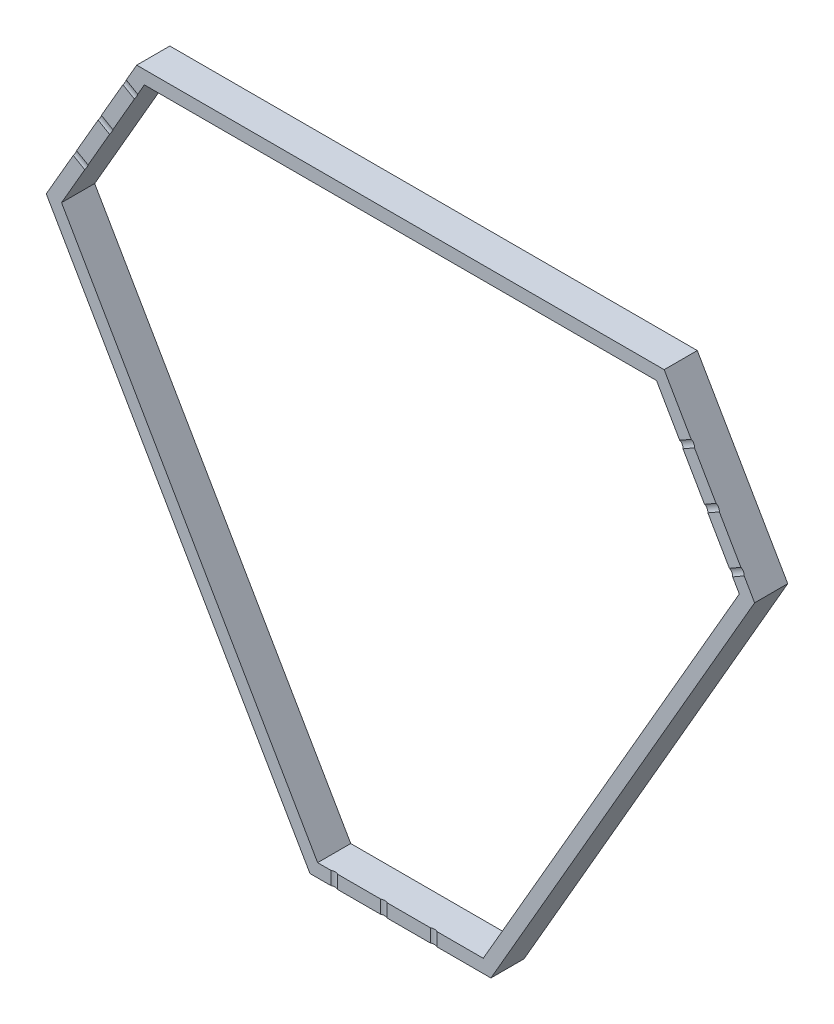
ISO-10303-21;
HEADER;
FILE_DESCRIPTION(('STEP AP214'),'2;1');
FILE_NAME('part.step','',(''),(''),'','','');
FILE_SCHEMA(('AUTOMOTIVE_DESIGN { 1 0 10303 214 1 1 1 1 }'));
ENDSEC;
DATA;
#1=APPLICATION_CONTEXT('core data for automotive mechanical design processes');
#2=APPLICATION_PROTOCOL_DEFINITION('international standard','automotive_design',2000,#1);
#3=PRODUCT_CONTEXT('',#1,'mechanical');
#4=PRODUCT('Part','Part','',(#3));
#5=PRODUCT_RELATED_PRODUCT_CATEGORY('part','',(#4));
#6=PRODUCT_DEFINITION_FORMATION('','',#4);
#7=PRODUCT_DEFINITION_CONTEXT('part definition',#1,'design');
#8=PRODUCT_DEFINITION('design','',#6,#7);
#9=PRODUCT_DEFINITION_SHAPE('','',#8);
#10=(LENGTH_UNIT() NAMED_UNIT(*) SI_UNIT(.MILLI.,.METRE.));
#11=(NAMED_UNIT(*) PLANE_ANGLE_UNIT() SI_UNIT($,.RADIAN.));
#12=(NAMED_UNIT(*) SI_UNIT($,.STERADIAN.) SOLID_ANGLE_UNIT());
#13=UNCERTAINTY_MEASURE_WITH_UNIT(LENGTH_MEASURE(1.E-05),#10,'distance_accuracy_value','');
#14=(GEOMETRIC_REPRESENTATION_CONTEXT(3) GLOBAL_UNCERTAINTY_ASSIGNED_CONTEXT((#13)) GLOBAL_UNIT_ASSIGNED_CONTEXT((#10,
#11,#12)) REPRESENTATION_CONTEXT('',''));
#15=CARTESIAN_POINT('',(0.,0.,0.));
#16=DIRECTION('',(0.,0.,1.));
#17=DIRECTION('',(1.,0.,0.));
#18=AXIS2_PLACEMENT_3D('',#15,#16,#17);
#19=CARTESIAN_POINT('',(0.,0.,-200.));
#20=DIRECTION('',(0.,0.,-1.));
#21=DIRECTION('',(-1.,0.,0.));
#22=AXIS2_PLACEMENT_3D('',#19,#20,#21);
#23=PLANE('',#22);
#24=DIRECTION('',(0.500000000000001,0.866025403784438,0.));
#25=VECTOR('',#24,1.);
#26=CARTESIAN_POINT('',(-221.540106333287,47.0762213579484,-200.));
#27=LINE('',#26,#25);
#28=CARTESIAN_POINT('',(-180.539682271737,118.091038964423,-200.));
#29=VERTEX_POINT('',#28);
#30=CARTESIAN_POINT('',(-167.539682271737,140.607699462818,-200.));
#31=VERTEX_POINT('',#30);
#32=EDGE_CURVE('E639',#29,#31,#27,.T.);
#33=ORIENTED_EDGE('',*,*,#32,.F.);
#34=DIRECTION('',(-0.866025403784438,0.5,0.));
#35=VECTOR('',#34,1.);
#36=CARTESIAN_POINT('',(-173.611479041461,114.091038964423,-200.));
#37=LINE('',#36,#35);
#38=CARTESIAN_POINT('',(-173.611479041461,114.091038964423,-200.));
#39=VERTEX_POINT('',#38);
#40=EDGE_CURVE('E521',#39,#29,#37,.T.);
#41=ORIENTED_EDGE('',*,*,#40,.F.);
#42=DIRECTION('',(0.500000000000001,0.866025403784438,0.));
#43=VECTOR('',#42,1.);
#44=CARTESIAN_POINT('',(-181.611475801544,100.234638115573,-200.));
#45=LINE('',#44,#43);
#46=CARTESIAN_POINT('',(-160.611479041461,136.607699462818,-200.));
#47=VERTEX_POINT('',#46);
#48=EDGE_CURVE('E466',#39,#47,#45,.T.);
#49=ORIENTED_EDGE('',*,*,#48,.T.);
#50=DIRECTION('',(-0.866025403784439,0.5,0.));
#51=VECTOR('',#50,1.);
#52=CARTESIAN_POINT('',(-160.611479041461,136.607699462818,-200.));
#53=LINE('',#52,#51);
#54=EDGE_CURVE('E337',#31,#47,#53,.F.);
#55=ORIENTED_EDGE('',*,*,#54,.F.);
#56=EDGE_LOOP('',(#33,#41,#49,#55));
#57=FACE_BOUND('',#56,.T.);
#58=ADVANCED_FACE('F43',(#57),#23,.F.);
#59=CARTESIAN_POINT('',(-195.539682271737,92.1102768508899,-200.));
#60=VERTEX_POINT('',#59);
#61=CARTESIAN_POINT('',(-182.539682271737,114.626937349285,-200.));
#62=VERTEX_POINT('',#61);
#63=EDGE_CURVE('E543',#60,#62,#27,.T.);
#64=ORIENTED_EDGE('',*,*,#63,.F.);
#65=DIRECTION('',(-0.866025403784438,0.5,0.));
#66=VECTOR('',#65,1.);
#67=CARTESIAN_POINT('',(-188.611479041461,88.1102768508897,-200.));
#68=LINE('',#67,#66);
#69=CARTESIAN_POINT('',(-188.611479041461,88.1102768508897,-200.));
#70=VERTEX_POINT('',#69);
#71=EDGE_CURVE('E534',#70,#60,#68,.T.);
#72=ORIENTED_EDGE('',*,*,#71,.F.);
#73=CARTESIAN_POINT('',(-175.611479041461,110.626937349285,-200.));
#74=VERTEX_POINT('',#73);
#75=EDGE_CURVE('E523',#70,#74,#45,.T.);
#76=ORIENTED_EDGE('',*,*,#75,.T.);
#77=DIRECTION('',(-0.866025403784438,0.5,0.));
#78=VECTOR('',#77,1.);
#79=CARTESIAN_POINT('',(-175.611479041461,110.626937349285,-200.));
#80=LINE('',#79,#78);
#81=EDGE_CURVE('E538',#62,#74,#80,.F.);
#82=ORIENTED_EDGE('',*,*,#81,.F.);
#83=EDGE_LOOP('',(#64,#72,#76,#82));
#84=FACE_BOUND('',#83,.T.);
#85=ADVANCED_FACE('F568',(#84),#23,.F.);
#86=DIRECTION('',(0.499999999999999,-0.866025403784439,0.));
#87=VECTOR('',#86,1.);
#88=CARTESIAN_POINT('',(151.539256776807,168.321249362758,-200.));
#89=LINE('',#88,#87);
#90=CARTESIAN_POINT('',(192.539680838357,97.3064317562841,-200.));
#91=VERTEX_POINT('',#90);
#92=CARTESIAN_POINT('',(205.539680838357,74.7897712578887,-200.));
#93=VERTEX_POINT('',#92);
#94=EDGE_CURVE('E608',#91,#93,#89,.T.);
#95=ORIENTED_EDGE('',*,*,#94,.F.);
#96=DIRECTION('',(0.866025403784439,0.5,0.));
#97=VECTOR('',#96,1.);
#98=CARTESIAN_POINT('',(185.611477608081,93.3064317562838,-200.));
#99=LINE('',#98,#97);
#100=CARTESIAN_POINT('',(185.611477608081,93.3064317562838,-200.));
#101=VERTEX_POINT('',#100);
#102=EDGE_CURVE('E614',#101,#91,#99,.T.);
#103=ORIENTED_EDGE('',*,*,#102,.F.);
#104=DIRECTION('',(0.499999999999999,-0.866025403784439,0.));
#105=VECTOR('',#104,1.);
#106=CARTESIAN_POINT('',(177.611480847998,107.162832605133,-200.));
#107=LINE('',#106,#105);
#108=CARTESIAN_POINT('',(198.611477608081,70.7897712578885,-200.));
#109=VERTEX_POINT('',#108);
#110=EDGE_CURVE('E427',#101,#109,#107,.T.);
#111=ORIENTED_EDGE('',*,*,#110,.T.);
#112=DIRECTION('',(0.866025403784439,0.5,0.));
#113=VECTOR('',#112,1.);
#114=CARTESIAN_POINT('',(198.611477608081,70.7897712578885,-200.));
#115=LINE('',#114,#113);
#116=EDGE_CURVE('E349',#93,#109,#115,.F.);
#117=ORIENTED_EDGE('',*,*,#116,.F.);
#118=EDGE_LOOP('',(#95,#103,#111,#117));
#119=FACE_BOUND('',#118,.T.);
#120=ADVANCED_FACE('F574',(#119),#23,.F.);
#121=DIRECTION('',(-0.866025403784439,0.5,0.));
#122=VECTOR('',#121,1.);
#123=CARTESIAN_POINT('',(-158.611479041461,140.071801077956,-200.));
#124=LINE('',#123,#122);
#125=CARTESIAN_POINT('',(-158.611479041461,140.071801077956,-200.));
#126=VERTEX_POINT('',#125);
#127=CARTESIAN_POINT('',(-165.539682271737,144.071801077956,-200.));
#128=VERTEX_POINT('',#127);
#129=EDGE_CURVE('E516',#126,#128,#124,.T.);
#130=ORIENTED_EDGE('',*,*,#129,.F.);
#131=CARTESIAN_POINT('',(-154.611479041461,147.000004308232,-200.));
#132=VERTEX_POINT('',#131);
#133=EDGE_CURVE('E320',#126,#132,#45,.T.);
#134=ORIENTED_EDGE('',*,*,#133,.T.);
#135=DIRECTION('',(1.,1.37761646906916E-10,0.));
#136=VECTOR('',#135,1.);
#137=CARTESIAN_POINT('',(-246.611440606458,147.000004295558,-200.));
#138=LINE('',#137,#136);
#139=CARTESIAN_POINT('',(154.611477608082,147.000006790919,-200.));
#140=VERTEX_POINT('',#139);
#141=EDGE_CURVE('E321',#132,#140,#138,.T.);
#142=ORIENTED_EDGE('',*,*,#141,.T.);
#143=CARTESIAN_POINT('',(168.611477608081,122.751295484955,-200.));
#144=VERTEX_POINT('',#143);
#145=EDGE_CURVE('E402',#140,#144,#107,.T.);
#146=ORIENTED_EDGE('',*,*,#145,.T.);
#147=DIRECTION('',(0.866025403784439,0.5,0.));
#148=VECTOR('',#147,1.);
#149=CARTESIAN_POINT('',(168.611477608081,122.751295484955,-200.));
#150=LINE('',#149,#148);
#151=CARTESIAN_POINT('',(175.539680838357,126.751295484955,-200.));
#152=VERTEX_POINT('',#151);
#153=EDGE_CURVE('E613',#152,#144,#150,.F.);
#154=ORIENTED_EDGE('',*,*,#153,.F.);
#155=CARTESIAN_POINT('',(159.230283669615,155.000000022035,-200.));
#156=VERTEX_POINT('',#155);
#157=EDGE_CURVE('E476',#156,#152,#89,.T.);
#158=ORIENTED_EDGE('',*,*,#157,.F.);
#159=DIRECTION('',(-1.,-1.38387047711903E-10,0.));
#160=VECTOR('',#159,1.);
#161=CARTESIAN_POINT('',(268.467875151726,155.000000037152,-200.));
#162=LINE('',#161,#160);
#163=CARTESIAN_POINT('',(-159.230283695059,154.999999977965,-200.));
#164=VERTEX_POINT('',#163);
#165=EDGE_CURVE('E424',#156,#164,#162,.T.);
#166=ORIENTED_EDGE('',*,*,#165,.T.);
#167=EDGE_CURVE('E262',#128,#164,#27,.T.);
#168=ORIENTED_EDGE('',*,*,#167,.F.);
#169=EDGE_LOOP('',(#130,#134,#142,#146,#154,#158,#166,#168));
#170=FACE_BOUND('',#169,.T.);
#171=ADVANCED_FACE('F473',(#170),#23,.F.);
#172=CARTESIAN_POINT('',(177.539680838357,123.287193869817,-200.));
#173=VERTEX_POINT('',#172);
#174=CARTESIAN_POINT('',(190.539680838357,100.770533371422,-200.));
#175=VERTEX_POINT('',#174);
#176=EDGE_CURVE('E548',#173,#175,#89,.T.);
#177=ORIENTED_EDGE('',*,*,#176,.F.);
#178=DIRECTION('',(0.866025403784439,0.5,0.));
#179=VECTOR('',#178,1.);
#180=CARTESIAN_POINT('',(170.611477608081,119.287193869817,-200.));
#181=LINE('',#180,#179);
#182=CARTESIAN_POINT('',(170.611477608081,119.287193869817,-200.));
#183=VERTEX_POINT('',#182);
#184=EDGE_CURVE('E353',#183,#173,#181,.T.);
#185=ORIENTED_EDGE('',*,*,#184,.F.);
#186=CARTESIAN_POINT('',(183.611477608081,96.7705333714216,-200.));
#187=VERTEX_POINT('',#186);
#188=EDGE_CURVE('E621',#183,#187,#107,.T.);
#189=ORIENTED_EDGE('',*,*,#188,.T.);
#190=DIRECTION('',(0.866025403784439,0.5,0.));
#191=VECTOR('',#190,1.);
#192=CARTESIAN_POINT('',(183.611477608081,96.7705333714216,-200.));
#193=LINE('',#192,#191);
#194=EDGE_CURVE('E547',#175,#187,#193,.F.);
#195=ORIENTED_EDGE('',*,*,#194,.F.);
#196=EDGE_LOOP('',(#177,#185,#189,#195));
#197=FACE_BOUND('',#196,.T.);
#198=ADVANCED_FACE('F591',(#197),#23,.F.);
#199=CARTESIAN_POINT('',(-213.849079444843,60.3974706911128,-200.));
#200=VERTEX_POINT('',#199);
#201=CARTESIAN_POINT('',(-197.539682271737,88.6461752357522,-200.));
#202=VERTEX_POINT('',#201);
#203=EDGE_CURVE('E331',#200,#202,#27,.T.);
#204=ORIENTED_EDGE('',*,*,#203,.F.);
#205=DIRECTION('',(0.5,-0.866025403784439,0.));
#206=VECTOR('',#205,1.);
#207=CARTESIAN_POINT('',(-121.761531385957,-99.1028412015677,-200.));
#208=LINE('',#207,#206);
#209=CARTESIAN_POINT('',(-54.6187957541475,-215.397470720707,-200.));
#210=VERTEX_POINT('',#209);
#211=EDGE_CURVE('E324',#200,#210,#208,.T.);
#212=ORIENTED_EDGE('',*,*,#211,.T.);
#213=DIRECTION('',(-1.,0.,0.));
#214=VECTOR('',#213,1.);
#215=CARTESIAN_POINT('',(70.0008495564807,-215.397470720707,-200.));
#216=LINE('',#215,#214);
#217=CARTESIAN_POINT('',(-41.9999985666196,-215.397470720707,-200.));
#218=VERTEX_POINT('',#217);
#219=EDGE_CURVE('E264',#218,#210,#216,.T.);
#220=ORIENTED_EDGE('',*,*,#219,.F.);
#221=DIRECTION('',(0.,-1.,0.));
#222=VECTOR('',#221,1.);
#223=CARTESIAN_POINT('',(-41.9999985666196,-207.397470720707,-200.));
#224=LINE('',#223,#222);
#225=CARTESIAN_POINT('',(-41.9999985666196,-207.397470720707,-200.));
#226=VERTEX_POINT('',#225);
#227=EDGE_CURVE('E405',#226,#218,#224,.T.);
#228=ORIENTED_EDGE('',*,*,#227,.F.);
#229=DIRECTION('',(-1.,0.,0.));
#230=VECTOR('',#229,1.);
#231=CARTESIAN_POINT('',(3.99999495354567,-207.397470720707,-200.));
#232=LINE('',#231,#230);
#233=CARTESIAN_POINT('',(-49.9999985666202,-207.397470720706,-200.));
#234=VERTEX_POINT('',#233);
#235=EDGE_CURVE('E397',#226,#234,#232,.T.);
#236=ORIENTED_EDGE('',*,*,#235,.T.);
#237=DIRECTION('',(-0.499999995522719,0.866025406369398,0.));
#238=VECTOR('',#237,1.);
#239=CARTESIAN_POINT('',(-3.99997235182845,-287.07186238818,-200.));
#240=LINE('',#239,#238);
#241=CARTESIAN_POINT('',(-204.611479041461,60.3974639297883,-200.));
#242=VERTEX_POINT('',#241);
#243=EDGE_CURVE('E327',#234,#242,#240,.T.);
#244=ORIENTED_EDGE('',*,*,#243,.T.);
#245=CARTESIAN_POINT('',(-190.611479041461,84.6461752357519,-200.));
#246=VERTEX_POINT('',#245);
#247=EDGE_CURVE('E465',#242,#246,#45,.T.);
#248=ORIENTED_EDGE('',*,*,#247,.T.);
#249=DIRECTION('',(-0.866025403784438,0.5,0.));
#250=VECTOR('',#249,1.);
#251=CARTESIAN_POINT('',(-190.611479041461,84.6461752357519,-200.));
#252=LINE('',#251,#250);
#253=EDGE_CURVE('E528',#202,#246,#252,.F.);
#254=ORIENTED_EDGE('',*,*,#253,.F.);
#255=EDGE_LOOP('',(#204,#212,#220,#228,#236,#244,#248,#254));
#256=FACE_BOUND('',#255,.T.);
#257=ADVANCED_FACE('F407',(#256),#23,.F.);
#258=CARTESIAN_POINT('',(-11.9999985666196,-215.397470720707,-200.));
#259=VERTEX_POINT('',#258);
#260=CARTESIAN_POINT('',(-37.9999985666196,-215.397470720707,-200.));
#261=VERTEX_POINT('',#260);
#262=EDGE_CURVE('E641',#259,#261,#216,.T.);
#263=ORIENTED_EDGE('',*,*,#262,.F.);
#264=DIRECTION('',(0.,-1.,0.));
#265=VECTOR('',#264,1.);
#266=CARTESIAN_POINT('',(-11.9999985666196,-207.397470720707,-200.));
#267=LINE('',#266,#265);
#268=CARTESIAN_POINT('',(-11.9999985666196,-207.397470720707,-200.));
#269=VERTEX_POINT('',#268);
#270=EDGE_CURVE('E314',#269,#259,#267,.T.);
#271=ORIENTED_EDGE('',*,*,#270,.F.);
#272=CARTESIAN_POINT('',(-37.9999985666196,-207.397470720707,-200.));
#273=VERTEX_POINT('',#272);
#274=EDGE_CURVE('E401',#269,#273,#232,.T.);
#275=ORIENTED_EDGE('',*,*,#274,.T.);
#276=DIRECTION('',(0.,-1.,0.));
#277=VECTOR('',#276,1.);
#278=CARTESIAN_POINT('',(-37.9999985666196,-207.397470720707,-200.));
#279=LINE('',#278,#277);
#280=EDGE_CURVE('E354',#261,#273,#279,.F.);
#281=ORIENTED_EDGE('',*,*,#280,.F.);
#282=EDGE_LOOP('',(#263,#271,#275,#281));
#283=FACE_BOUND('',#282,.T.);
#284=ADVANCED_FACE('F420',(#283),#23,.F.);
#285=CARTESIAN_POINT('',(200.611477608081,67.3256696427507,-200.));
#286=VERTEX_POINT('',#285);
#287=CARTESIAN_POINT('',(204.611504666339,60.3974195461969,-200.));
#288=VERTEX_POINT('',#287);
#289=EDGE_CURVE('E426',#286,#288,#107,.T.);
#290=ORIENTED_EDGE('',*,*,#289,.T.);
#291=DIRECTION('',(-0.499999988947861,-0.866025410165394,0.));
#292=VECTOR('',#291,1.);
#293=CARTESIAN_POINT('',(250.611606942048,140.071936189287,-200.));
#294=LINE('',#293,#292);
#295=CARTESIAN_POINT('',(50.0000572399014,-207.397470720707,-200.));
#296=VERTEX_POINT('',#295);
#297=EDGE_CURVE('E255',#288,#296,#294,.T.);
#298=ORIENTED_EDGE('',*,*,#297,.T.);
#299=CARTESIAN_POINT('',(22.0000014333804,-207.397470720707,-200.));
#300=VERTEX_POINT('',#299);
#301=EDGE_CURVE('E384',#296,#300,#232,.T.);
#302=ORIENTED_EDGE('',*,*,#301,.T.);
#303=DIRECTION('',(0.,-1.,0.));
#304=VECTOR('',#303,1.);
#305=CARTESIAN_POINT('',(22.0000014333804,-207.397470720707,-200.));
#306=LINE('',#305,#304);
#307=CARTESIAN_POINT('',(22.0000014333804,-215.397470720707,-200.));
#308=VERTEX_POINT('',#307);
#309=EDGE_CURVE('E68',#308,#300,#306,.F.);
#310=ORIENTED_EDGE('',*,*,#309,.F.);
#311=CARTESIAN_POINT('',(54.6187957366916,-215.397470720707,-200.));
#312=VERTEX_POINT('',#311);
#313=EDGE_CURVE('E256',#312,#308,#216,.T.);
#314=ORIENTED_EDGE('',*,*,#313,.F.);
#315=DIRECTION('',(0.499999999940077,0.866025403819035,0.));
#316=VECTOR('',#315,1.);
#317=CARTESIAN_POINT('',(0.,-310.,-200.));
#318=LINE('',#317,#316);
#319=CARTESIAN_POINT('',(213.84907941067,60.3974707503004,-200.));
#320=VERTEX_POINT('',#319);
#321=EDGE_CURVE('E47',#312,#320,#318,.T.);
#322=ORIENTED_EDGE('',*,*,#321,.T.);
#323=CARTESIAN_POINT('',(207.539680838357,71.3256696427509,-200.));
#324=VERTEX_POINT('',#323);
#325=EDGE_CURVE('E342',#324,#320,#89,.T.);
#326=ORIENTED_EDGE('',*,*,#325,.F.);
#327=DIRECTION('',(0.866025403784439,0.5,0.));
#328=VECTOR('',#327,1.);
#329=CARTESIAN_POINT('',(200.611477608081,67.3256696427507,-200.));
#330=LINE('',#329,#328);
#331=EDGE_CURVE('E429',#286,#324,#330,.T.);
#332=ORIENTED_EDGE('',*,*,#331,.F.);
#333=EDGE_LOOP('',(#290,#298,#302,#310,#314,#322,#326,#332));
#334=FACE_BOUND('',#333,.T.);
#335=ADVANCED_FACE('F258',(#334),#23,.F.);
#336=CARTESIAN_POINT('',(18.0000014333804,-215.397470720707,-200.));
#337=VERTEX_POINT('',#336);
#338=CARTESIAN_POINT('',(-7.99999856661964,-215.397470720707,-200.));
#339=VERTEX_POINT('',#338);
#340=EDGE_CURVE('E261',#337,#339,#216,.T.);
#341=ORIENTED_EDGE('',*,*,#340,.F.);
#342=DIRECTION('',(0.,-1.,0.));
#343=VECTOR('',#342,1.);
#344=CARTESIAN_POINT('',(18.0000014333804,-207.397470720707,-200.));
#345=LINE('',#344,#343);
#346=CARTESIAN_POINT('',(18.0000014333804,-207.397470720707,-200.));
#347=VERTEX_POINT('',#346);
#348=EDGE_CURVE('E313',#347,#337,#345,.T.);
#349=ORIENTED_EDGE('',*,*,#348,.F.);
#350=CARTESIAN_POINT('',(-7.99999856661964,-207.397470720707,-200.));
#351=VERTEX_POINT('',#350);
#352=EDGE_CURVE('E60',#347,#351,#232,.T.);
#353=ORIENTED_EDGE('',*,*,#352,.T.);
#354=DIRECTION('',(0.,-1.,0.));
#355=VECTOR('',#354,1.);
#356=CARTESIAN_POINT('',(-7.99999856661964,-207.397470720707,-200.));
#357=LINE('',#356,#355);
#358=EDGE_CURVE('E411',#339,#351,#357,.F.);
#359=ORIENTED_EDGE('',*,*,#358,.F.);
#360=EDGE_LOOP('',(#341,#349,#353,#359));
#361=FACE_BOUND('',#360,.T.);
#362=ADVANCED_FACE('F555',(#361),#23,.F.);
#363=CARTESIAN_POINT('',(0.,0.,-220.));
#364=DIRECTION('',(0.,0.,-1.));
#365=DIRECTION('',(-1.,0.,0.));
#366=AXIS2_PLACEMENT_3D('',#363,#364,#365);
#367=PLANE('',#366);
#368=DIRECTION('',(0.5,-0.866025403784439,0.));
#369=VECTOR('',#368,1.);
#370=CARTESIAN_POINT('',(-121.761531385957,-99.1028412015677,-220.));
#371=LINE('',#370,#369);
#372=CARTESIAN_POINT('',(-213.849079444843,60.3974706911128,-220.));
#373=VERTEX_POINT('',#372);
#374=CARTESIAN_POINT('',(-54.6187957541475,-215.397470720707,-220.));
#375=VERTEX_POINT('',#374);
#376=EDGE_CURVE('E332',#373,#375,#371,.T.);
#377=ORIENTED_EDGE('',*,*,#376,.F.);
#378=DIRECTION('',(0.500000000000001,0.866025403784438,0.));
#379=VECTOR('',#378,1.);
#380=CARTESIAN_POINT('',(-221.540106333287,47.0762213579484,-220.));
#381=LINE('',#380,#379);
#382=CARTESIAN_POINT('',(-159.230283695059,154.999999977965,-220.));
#383=VERTEX_POINT('',#382);
#384=EDGE_CURVE('E323',#373,#383,#381,.T.);
#385=ORIENTED_EDGE('',*,*,#384,.T.);
#386=DIRECTION('',(-1.,-1.38387047711903E-10,0.));
#387=VECTOR('',#386,1.);
#388=CARTESIAN_POINT('',(268.467875151726,155.000000037152,-220.));
#389=LINE('',#388,#387);
#390=CARTESIAN_POINT('',(159.230283669615,155.000000022035,-220.));
#391=VERTEX_POINT('',#390);
#392=EDGE_CURVE('E341',#391,#383,#389,.T.);
#393=ORIENTED_EDGE('',*,*,#392,.F.);
#394=DIRECTION('',(0.499999999999999,-0.866025403784439,0.));
#395=VECTOR('',#394,1.);
#396=CARTESIAN_POINT('',(151.539256776807,168.321249362758,-220.));
#397=LINE('',#396,#395);
#398=CARTESIAN_POINT('',(213.84907941067,60.3974707503004,-220.));
#399=VERTEX_POINT('',#398);
#400=EDGE_CURVE('E317',#391,#399,#397,.T.);
#401=ORIENTED_EDGE('',*,*,#400,.T.);
#402=DIRECTION('',(0.499999999940077,0.866025403819035,0.));
#403=VECTOR('',#402,1.);
#404=CARTESIAN_POINT('',(0.,-310.,-220.));
#405=LINE('',#404,#403);
#406=CARTESIAN_POINT('',(54.6187957366916,-215.397470720707,-220.));
#407=VERTEX_POINT('',#406);
#408=EDGE_CURVE('E352',#407,#399,#405,.T.);
#409=ORIENTED_EDGE('',*,*,#408,.F.);
#410=DIRECTION('',(-1.,0.,0.));
#411=VECTOR('',#410,1.);
#412=CARTESIAN_POINT('',(70.0008495564807,-215.397470720707,-220.));
#413=LINE('',#412,#411);
#414=EDGE_CURVE('E269',#407,#375,#413,.T.);
#415=ORIENTED_EDGE('',*,*,#414,.T.);
#416=EDGE_LOOP('',(#377,#385,#393,#401,#409,#415));
#417=FACE_BOUND('',#416,.T.);
#418=DIRECTION('',(-0.499999995522719,0.866025406369398,0.));
#419=VECTOR('',#418,1.);
#420=CARTESIAN_POINT('',(-3.99997235182845,-287.07186238818,-220.));
#421=LINE('',#420,#419);
#422=CARTESIAN_POINT('',(-49.9999985666202,-207.397470720706,-220.));
#423=VERTEX_POINT('',#422);
#424=CARTESIAN_POINT('',(-204.611479041461,60.3974639297883,-220.));
#425=VERTEX_POINT('',#424);
#426=EDGE_CURVE('E328',#423,#425,#421,.T.);
#427=ORIENTED_EDGE('',*,*,#426,.F.);
#428=DIRECTION('',(-1.,0.,0.));
#429=VECTOR('',#428,1.);
#430=CARTESIAN_POINT('',(3.99999495354567,-207.397470720707,-220.));
#431=LINE('',#430,#429);
#432=CARTESIAN_POINT('',(50.0000572399014,-207.397470720707,-220.));
#433=VERTEX_POINT('',#432);
#434=EDGE_CURVE('E344',#433,#423,#431,.T.);
#435=ORIENTED_EDGE('',*,*,#434,.F.);
#436=DIRECTION('',(-0.499999988947861,-0.866025410165394,0.));
#437=VECTOR('',#436,1.);
#438=CARTESIAN_POINT('',(250.611606942048,140.071936189287,-220.));
#439=LINE('',#438,#437);
#440=CARTESIAN_POINT('',(204.611504666339,60.3974195461969,-220.));
#441=VERTEX_POINT('',#440);
#442=EDGE_CURVE('E350',#441,#433,#439,.T.);
#443=ORIENTED_EDGE('',*,*,#442,.F.);
#444=DIRECTION('',(0.499999999999999,-0.866025403784439,0.));
#445=VECTOR('',#444,1.);
#446=CARTESIAN_POINT('',(177.611480847998,107.162832605133,-220.));
#447=LINE('',#446,#445);
#448=CARTESIAN_POINT('',(154.611477608082,147.000006790919,-220.));
#449=VERTEX_POINT('',#448);
#450=EDGE_CURVE('E346',#449,#441,#447,.T.);
#451=ORIENTED_EDGE('',*,*,#450,.F.);
#452=DIRECTION('',(1.,1.37761646906916E-10,0.));
#453=VECTOR('',#452,1.);
#454=CARTESIAN_POINT('',(-246.611440606458,147.000004295558,-220.));
#455=LINE('',#454,#453);
#456=CARTESIAN_POINT('',(-154.611479041461,147.000004308232,-220.));
#457=VERTEX_POINT('',#456);
#458=EDGE_CURVE('E338',#457,#449,#455,.T.);
#459=ORIENTED_EDGE('',*,*,#458,.F.);
#460=DIRECTION('',(0.500000000000001,0.866025403784438,0.));
#461=VECTOR('',#460,1.);
#462=CARTESIAN_POINT('',(-181.611475801544,100.234638115573,-220.));
#463=LINE('',#462,#461);
#464=EDGE_CURVE('E334',#425,#457,#463,.T.);
#465=ORIENTED_EDGE('',*,*,#464,.F.);
#466=EDGE_LOOP('',(#427,#435,#443,#451,#459,#465));
#467=FACE_BOUND('',#466,.T.);
#468=ADVANCED_FACE('F390',(#417,#467),#367,.T.);
#469=CARTESIAN_POINT('',(-181.611475801544,100.234638115573,140.));
#470=DIRECTION('',(0.866025403784437,-0.5,0.));
#471=DIRECTION('',(0.,0.,-1.));
#472=AXIS2_PLACEMENT_3D('',#469,#470,#471);
#473=PLANE('',#472);
#474=ORIENTED_EDGE('',*,*,#247,.F.);
#475=DIRECTION('',(0.,0.,-1.));
#476=VECTOR('',#475,1.);
#477=CARTESIAN_POINT('',(-204.611479041461,60.3974639297883,140.));
#478=LINE('',#477,#476);
#479=EDGE_CURVE('E445',#242,#425,#478,.T.);
#480=ORIENTED_EDGE('',*,*,#479,.T.);
#481=ORIENTED_EDGE('',*,*,#464,.T.);
#482=DIRECTION('',(0.,0.,-1.));
#483=VECTOR('',#482,1.);
#484=CARTESIAN_POINT('',(-154.611479041461,147.000004308232,140.));
#485=LINE('',#484,#483);
#486=EDGE_CURVE('E439',#132,#457,#485,.T.);
#487=ORIENTED_EDGE('',*,*,#486,.F.);
#488=ORIENTED_EDGE('',*,*,#133,.F.);
#489=CARTESIAN_POINT('',(-159.611479041461,138.339750270387,-196.25));
#490=DIRECTION('',(-0.866025403784439,0.5,0.));
#491=DIRECTION('',(0.5,0.866025403784439,0.));
#492=AXIS2_PLACEMENT_3D('',#489,#490,#491);
#493=CIRCLE('',#492,4.25);
#494=EDGE_CURVE('E451',#126,#47,#493,.T.);
#495=ORIENTED_EDGE('',*,*,#494,.T.);
#496=ORIENTED_EDGE('',*,*,#48,.F.);
#497=CARTESIAN_POINT('',(-174.611479041461,112.358988156854,-196.25));
#498=DIRECTION('',(-0.866025403784438,0.5,0.));
#499=DIRECTION('',(0.5,0.866025403784438,0.));
#500=AXIS2_PLACEMENT_3D('',#497,#498,#499);
#501=CIRCLE('',#500,4.25);
#502=EDGE_CURVE('E499',#39,#74,#501,.T.);
#503=ORIENTED_EDGE('',*,*,#502,.T.);
#504=ORIENTED_EDGE('',*,*,#75,.F.);
#505=CARTESIAN_POINT('',(-189.611479041461,86.3782260433208,-196.25));
#506=DIRECTION('',(-0.866025403784438,0.5,0.));
#507=DIRECTION('',(0.5,0.866025403784438,0.));
#508=AXIS2_PLACEMENT_3D('',#505,#506,#507);
#509=CIRCLE('',#508,4.25);
#510=EDGE_CURVE('E487',#70,#246,#509,.T.);
#511=ORIENTED_EDGE('',*,*,#510,.T.);
#512=EDGE_LOOP('',(#474,#480,#481,#487,#488,#495,#496,#503,#504,#511));
#513=FACE_BOUND('',#512,.T.);
#514=ADVANCED_FACE('F510',(#513),#473,.T.);
#515=CARTESIAN_POINT('',(-221.540106333287,47.0762213579484,0.));
#516=DIRECTION('',(0.866025403784437,-0.5,0.));
#517=DIRECTION('',(0.,0.,-1.));
#518=AXIS2_PLACEMENT_3D('',#515,#516,#517);
#519=PLANE('',#518);
#520=DIRECTION('',(0.,0.,-1.));
#521=VECTOR('',#520,1.);
#522=CARTESIAN_POINT('',(-213.849079444843,60.3974706911128,0.));
#523=LINE('',#522,#521);
#524=EDGE_CURVE('E316',#200,#373,#523,.T.);
#525=ORIENTED_EDGE('',*,*,#524,.F.);
#526=ORIENTED_EDGE('',*,*,#203,.T.);
#527=CARTESIAN_POINT('',(-196.539682271737,90.3782260433209,-196.25));
#528=DIRECTION('',(0.866025403784438,-0.5,0.));
#529=DIRECTION('',(0.5,0.866025403784438,0.));
#530=AXIS2_PLACEMENT_3D('',#527,#528,#529);
#531=CIRCLE('',#530,4.25);
#532=EDGE_CURVE('E493',#202,#60,#531,.T.);
#533=ORIENTED_EDGE('',*,*,#532,.T.);
#534=ORIENTED_EDGE('',*,*,#63,.T.);
#535=CARTESIAN_POINT('',(-181.539682271737,116.358988156854,-196.25));
#536=DIRECTION('',(0.866025403784438,-0.5,0.));
#537=DIRECTION('',(0.5,0.866025403784438,0.));
#538=AXIS2_PLACEMENT_3D('',#535,#536,#537);
#539=CIRCLE('',#538,4.25);
#540=EDGE_CURVE('E503',#62,#29,#539,.T.);
#541=ORIENTED_EDGE('',*,*,#540,.T.);
#542=ORIENTED_EDGE('',*,*,#32,.T.);
#543=CARTESIAN_POINT('',(-166.539682271737,142.339750270387,-196.25));
#544=DIRECTION('',(0.866025403784439,-0.5,0.));
#545=DIRECTION('',(0.5,0.866025403784439,0.));
#546=AXIS2_PLACEMENT_3D('',#543,#544,#545);
#547=CIRCLE('',#546,4.25);
#548=EDGE_CURVE('E444',#31,#128,#547,.T.);
#549=ORIENTED_EDGE('',*,*,#548,.T.);
#550=ORIENTED_EDGE('',*,*,#167,.T.);
#551=DIRECTION('',(0.,0.,1.));
#552=VECTOR('',#551,1.);
#553=CARTESIAN_POINT('',(-159.230283695059,154.999999977965,0.));
#554=LINE('',#553,#552);
#555=EDGE_CURVE('E481',#383,#164,#554,.T.);
#556=ORIENTED_EDGE('',*,*,#555,.F.);
#557=ORIENTED_EDGE('',*,*,#384,.F.);
#558=EDGE_LOOP('',(#525,#526,#533,#534,#541,#542,#549,#550,#556,#557));
#559=FACE_BOUND('',#558,.T.);
#560=ADVANCED_FACE('F638',(#559),#519,.F.);
#561=CARTESIAN_POINT('',(-3.99997235182845,-287.07186238818,0.));
#562=DIRECTION('',(0.866025406369398,0.499999995522719,0.));
#563=DIRECTION('',(0.,0.,-1.));
#564=AXIS2_PLACEMENT_3D('',#561,#562,#563);
#565=PLANE('',#564);
#566=ORIENTED_EDGE('',*,*,#243,.F.);
#567=DIRECTION('',(0.,0.,-1.));
#568=VECTOR('',#567,1.);
#569=CARTESIAN_POINT('',(-49.9999985666202,-207.397470720706,140.));
#570=LINE('',#569,#568);
#571=EDGE_CURVE('E373',#234,#423,#570,.T.);
#572=ORIENTED_EDGE('',*,*,#571,.T.);
#573=ORIENTED_EDGE('',*,*,#426,.T.);
#574=ORIENTED_EDGE('',*,*,#479,.F.);
#575=EDGE_LOOP('',(#566,#572,#573,#574));
#576=FACE_BOUND('',#575,.T.);
#577=ADVANCED_FACE('F394',(#576),#565,.T.);
#578=CARTESIAN_POINT('',(-246.611440606458,147.000004295558,-100.));
#579=DIRECTION('',(1.37761646906916E-10,-1.,0.));
#580=DIRECTION('',(0.,0.,-1.));
#581=AXIS2_PLACEMENT_3D('',#578,#579,#580);
#582=PLANE('',#581);
#583=ORIENTED_EDGE('',*,*,#141,.F.);
#584=ORIENTED_EDGE('',*,*,#486,.T.);
#585=ORIENTED_EDGE('',*,*,#458,.T.);
#586=DIRECTION('',(0.,0.,-1.));
#587=VECTOR('',#586,1.);
#588=CARTESIAN_POINT('',(154.611477608082,147.000006790919,140.));
#589=LINE('',#588,#587);
#590=EDGE_CURVE('E305',#140,#449,#589,.T.);
#591=ORIENTED_EDGE('',*,*,#590,.F.);
#592=EDGE_LOOP('',(#583,#584,#585,#591));
#593=FACE_BOUND('',#592,.T.);
#594=ADVANCED_FACE('F437',(#593),#582,.T.);
#595=CARTESIAN_POINT('',(151.539256776807,168.321249362758,0.));
#596=DIRECTION('',(-0.86602540378444,-0.5,0.));
#597=DIRECTION('',(-0.5,0.86602540378444,0.));
#598=AXIS2_PLACEMENT_3D('',#595,#596,#597);
#599=PLANE('',#598);
#600=DIRECTION('',(0.,0.,-1.));
#601=VECTOR('',#600,1.);
#602=CARTESIAN_POINT('',(159.230283669615,155.000000022035,0.));
#603=LINE('',#602,#601);
#604=EDGE_CURVE('E486',#156,#391,#603,.T.);
#605=ORIENTED_EDGE('',*,*,#604,.F.);
#606=ORIENTED_EDGE('',*,*,#157,.T.);
#607=CARTESIAN_POINT('',(176.539680838357,125.019244677386,-196.25));
#608=DIRECTION('',(-0.866025403784439,-0.5,0.));
#609=DIRECTION('',(0.5,-0.866025403784439,0.));
#610=AXIS2_PLACEMENT_3D('',#607,#608,#609);
#611=CIRCLE('',#610,4.25);
#612=EDGE_CURVE('E279',#152,#173,#611,.T.);
#613=ORIENTED_EDGE('',*,*,#612,.T.);
#614=ORIENTED_EDGE('',*,*,#176,.T.);
#615=CARTESIAN_POINT('',(191.539680838357,99.0384825638528,-196.25));
#616=DIRECTION('',(-0.866025403784439,-0.5,0.));
#617=DIRECTION('',(0.5,-0.866025403784439,0.));
#618=AXIS2_PLACEMENT_3D('',#615,#616,#617);
#619=CIRCLE('',#618,4.25);
#620=EDGE_CURVE('E290',#175,#91,#619,.T.);
#621=ORIENTED_EDGE('',*,*,#620,.T.);
#622=ORIENTED_EDGE('',*,*,#94,.T.);
#623=CARTESIAN_POINT('',(206.539680838357,73.0577204503196,-196.25));
#624=DIRECTION('',(-0.866025403784439,-0.5,0.));
#625=DIRECTION('',(0.5,-0.866025403784439,0.));
#626=AXIS2_PLACEMENT_3D('',#623,#624,#625);
#627=CIRCLE('',#626,4.25);
#628=EDGE_CURVE('E298',#93,#324,#627,.T.);
#629=ORIENTED_EDGE('',*,*,#628,.T.);
#630=ORIENTED_EDGE('',*,*,#325,.T.);
#631=DIRECTION('',(0.,0.,1.));
#632=VECTOR('',#631,1.);
#633=CARTESIAN_POINT('',(213.84907941067,60.3974707503004,0.));
#634=LINE('',#633,#632);
#635=EDGE_CURVE('E252',#399,#320,#634,.T.);
#636=ORIENTED_EDGE('',*,*,#635,.F.);
#637=ORIENTED_EDGE('',*,*,#400,.F.);
#638=EDGE_LOOP('',(#605,#606,#613,#614,#621,#622,#629,#630,#636,#637));
#639=FACE_BOUND('',#638,.T.);
#640=ADVANCED_FACE('F610',(#639),#599,.F.);
#641=CARTESIAN_POINT('',(3.99999495354567,-207.397470720707,140.));
#642=DIRECTION('',(0.,1.,0.));
#643=DIRECTION('',(1.,0.,0.));
#644=AXIS2_PLACEMENT_3D('',#641,#642,#643);
#645=PLANE('',#644);
#646=ORIENTED_EDGE('',*,*,#301,.F.);
#647=DIRECTION('',(0.,0.,-1.));
#648=VECTOR('',#647,1.);
#649=CARTESIAN_POINT('',(50.0000572399014,-207.397470720707,0.));
#650=LINE('',#649,#648);
#651=EDGE_CURVE('E276',#296,#433,#650,.T.);
#652=ORIENTED_EDGE('',*,*,#651,.T.);
#653=ORIENTED_EDGE('',*,*,#434,.T.);
#654=ORIENTED_EDGE('',*,*,#571,.F.);
#655=ORIENTED_EDGE('',*,*,#235,.F.);
#656=CARTESIAN_POINT('',(-39.9999985666196,-207.397470720707,-196.25));
#657=DIRECTION('',(0.,-1.,0.));
#658=DIRECTION('',(-1.,0.,0.));
#659=AXIS2_PLACEMENT_3D('',#656,#657,#658);
#660=CIRCLE('',#659,4.25);
#661=EDGE_CURVE('E365',#226,#273,#660,.T.);
#662=ORIENTED_EDGE('',*,*,#661,.T.);
#663=ORIENTED_EDGE('',*,*,#274,.F.);
#664=CARTESIAN_POINT('',(-9.99999856661963,-207.397470720707,-196.25));
#665=DIRECTION('',(0.,-1.,0.));
#666=DIRECTION('',(-1.,0.,0.));
#667=AXIS2_PLACEMENT_3D('',#664,#665,#666);
#668=CIRCLE('',#667,4.25);
#669=EDGE_CURVE('E358',#269,#351,#668,.T.);
#670=ORIENTED_EDGE('',*,*,#669,.T.);
#671=ORIENTED_EDGE('',*,*,#352,.F.);
#672=CARTESIAN_POINT('',(20.0000014333804,-207.397470720707,-196.25));
#673=DIRECTION('',(0.,-1.,0.));
#674=DIRECTION('',(-1.,0.,0.));
#675=AXIS2_PLACEMENT_3D('',#672,#673,#674);
#676=CIRCLE('',#675,4.25);
#677=EDGE_CURVE('E11',#347,#300,#676,.T.);
#678=ORIENTED_EDGE('',*,*,#677,.T.);
#679=EDGE_LOOP('',(#646,#652,#653,#654,#655,#662,#663,#670,#671,#678));
#680=FACE_BOUND('',#679,.T.);
#681=ADVANCED_FACE('F380',(#680),#645,.T.);
#682=CARTESIAN_POINT('',(70.0008495564807,-215.397470720707,0.));
#683=DIRECTION('',(0.,1.,0.));
#684=DIRECTION('',(1.,0.,0.));
#685=AXIS2_PLACEMENT_3D('',#682,#683,#684);
#686=PLANE('',#685);
#687=DIRECTION('',(0.,0.,-1.));
#688=VECTOR('',#687,1.);
#689=CARTESIAN_POINT('',(54.6187957366916,-215.397470720707,0.));
#690=LINE('',#689,#688);
#691=EDGE_CURVE('E250',#312,#407,#690,.T.);
#692=ORIENTED_EDGE('',*,*,#691,.F.);
#693=ORIENTED_EDGE('',*,*,#313,.T.);
#694=CARTESIAN_POINT('',(20.0000014333804,-215.397470720707,-196.25));
#695=DIRECTION('',(0.,1.,0.));
#696=DIRECTION('',(-1.,0.,0.));
#697=AXIS2_PLACEMENT_3D('',#694,#695,#696);
#698=CIRCLE('',#697,4.25);
#699=EDGE_CURVE('E53',#308,#337,#698,.T.);
#700=ORIENTED_EDGE('',*,*,#699,.T.);
#701=ORIENTED_EDGE('',*,*,#340,.T.);
#702=CARTESIAN_POINT('',(-9.99999856661963,-215.397470720707,-196.25));
#703=DIRECTION('',(0.,1.,0.));
#704=DIRECTION('',(-1.,0.,0.));
#705=AXIS2_PLACEMENT_3D('',#702,#703,#704);
#706=CIRCLE('',#705,4.25);
#707=EDGE_CURVE('E361',#339,#259,#706,.T.);
#708=ORIENTED_EDGE('',*,*,#707,.T.);
#709=ORIENTED_EDGE('',*,*,#262,.T.);
#710=CARTESIAN_POINT('',(-39.9999985666196,-215.397470720707,-196.25));
#711=DIRECTION('',(0.,1.,0.));
#712=DIRECTION('',(-1.,0.,0.));
#713=AXIS2_PLACEMENT_3D('',#710,#711,#712);
#714=CIRCLE('',#713,4.25);
#715=EDGE_CURVE('E369',#261,#218,#714,.T.);
#716=ORIENTED_EDGE('',*,*,#715,.T.);
#717=ORIENTED_EDGE('',*,*,#219,.T.);
#718=DIRECTION('',(0.,0.,1.));
#719=VECTOR('',#718,1.);
#720=CARTESIAN_POINT('',(-54.6187957541475,-215.397470720707,0.));
#721=LINE('',#720,#719);
#722=EDGE_CURVE('E453',#375,#210,#721,.T.);
#723=ORIENTED_EDGE('',*,*,#722,.F.);
#724=ORIENTED_EDGE('',*,*,#414,.F.);
#725=EDGE_LOOP('',(#692,#693,#700,#701,#708,#709,#716,#717,#723,#724));
#726=FACE_BOUND('',#725,.T.);
#727=ADVANCED_FACE('F266',(#726),#686,.F.);
#728=CARTESIAN_POINT('',(20.0000014333804,-207.397470720707,-196.25));
#729=DIRECTION('',(0.,-1.,0.));
#730=DIRECTION('',(-1.,0.,0.));
#731=AXIS2_PLACEMENT_3D('',#728,#729,#730);
#732=CYLINDRICAL_SURFACE('',#731,4.25);
#733=ORIENTED_EDGE('',*,*,#699,.F.);
#734=ORIENTED_EDGE('',*,*,#309,.T.);
#735=ORIENTED_EDGE('',*,*,#677,.F.);
#736=ORIENTED_EDGE('',*,*,#348,.T.);
#737=EDGE_LOOP('',(#733,#734,#735,#736));
#738=FACE_BOUND('',#737,.T.);
#739=ADVANCED_FACE('F556',(#738),#732,.F.);
#740=CARTESIAN_POINT('',(-9.99999856661963,-207.397470720707,-196.25));
#741=DIRECTION('',(0.,-1.,0.));
#742=DIRECTION('',(-1.,0.,0.));
#743=AXIS2_PLACEMENT_3D('',#740,#741,#742);
#744=CYLINDRICAL_SURFACE('',#743,4.25);
#745=ORIENTED_EDGE('',*,*,#707,.F.);
#746=ORIENTED_EDGE('',*,*,#358,.T.);
#747=ORIENTED_EDGE('',*,*,#669,.F.);
#748=ORIENTED_EDGE('',*,*,#270,.T.);
#749=EDGE_LOOP('',(#745,#746,#747,#748));
#750=FACE_BOUND('',#749,.T.);
#751=ADVANCED_FACE('F551',(#750),#744,.F.);
#752=CARTESIAN_POINT('',(-39.9999985666196,-207.397470720707,-196.25));
#753=DIRECTION('',(0.,-1.,0.));
#754=DIRECTION('',(-1.,0.,0.));
#755=AXIS2_PLACEMENT_3D('',#752,#753,#754);
#756=CYLINDRICAL_SURFACE('',#755,4.25);
#757=ORIENTED_EDGE('',*,*,#715,.F.);
#758=ORIENTED_EDGE('',*,*,#280,.T.);
#759=ORIENTED_EDGE('',*,*,#661,.F.);
#760=ORIENTED_EDGE('',*,*,#227,.T.);
#761=EDGE_LOOP('',(#757,#758,#759,#760));
#762=FACE_BOUND('',#761,.T.);
#763=ADVANCED_FACE('F413',(#762),#756,.F.);
#764=CARTESIAN_POINT('',(0.,-310.,0.));
#765=DIRECTION('',(0.866025403819035,-0.499999999940077,0.));
#766=DIRECTION('',(0.,0.,-1.));
#767=AXIS2_PLACEMENT_3D('',#764,#765,#766);
#768=PLANE('',#767);
#769=ORIENTED_EDGE('',*,*,#321,.F.);
#770=ORIENTED_EDGE('',*,*,#691,.T.);
#771=ORIENTED_EDGE('',*,*,#408,.T.);
#772=ORIENTED_EDGE('',*,*,#635,.T.);
#773=EDGE_LOOP('',(#769,#770,#771,#772));
#774=FACE_BOUND('',#773,.T.);
#775=ADVANCED_FACE('F248',(#774),#768,.T.);
#776=CARTESIAN_POINT('',(177.611480847998,107.162832605133,140.));
#777=DIRECTION('',(-0.86602540378444,-0.5,0.));
#778=DIRECTION('',(-0.5,0.86602540378444,0.));
#779=AXIS2_PLACEMENT_3D('',#776,#777,#778);
#780=PLANE('',#779);
#781=ORIENTED_EDGE('',*,*,#145,.F.);
#782=ORIENTED_EDGE('',*,*,#590,.T.);
#783=ORIENTED_EDGE('',*,*,#450,.T.);
#784=DIRECTION('',(0.,0.,-1.));
#785=VECTOR('',#784,1.);
#786=CARTESIAN_POINT('',(204.611504666339,60.3974195461969,140.));
#787=LINE('',#786,#785);
#788=EDGE_CURVE('E302',#288,#441,#787,.T.);
#789=ORIENTED_EDGE('',*,*,#788,.F.);
#790=ORIENTED_EDGE('',*,*,#289,.F.);
#791=CARTESIAN_POINT('',(199.611477608081,69.0577204503196,-196.25));
#792=DIRECTION('',(0.866025403784439,0.5,0.));
#793=DIRECTION('',(0.5,-0.866025403784439,0.));
#794=AXIS2_PLACEMENT_3D('',#791,#792,#793);
#795=CIRCLE('',#794,4.25);
#796=EDGE_CURVE('E294',#286,#109,#795,.T.);
#797=ORIENTED_EDGE('',*,*,#796,.T.);
#798=ORIENTED_EDGE('',*,*,#110,.F.);
#799=CARTESIAN_POINT('',(184.611477608081,95.0384825638527,-196.25));
#800=DIRECTION('',(0.866025403784439,0.5,0.));
#801=DIRECTION('',(0.5,-0.866025403784439,0.));
#802=AXIS2_PLACEMENT_3D('',#799,#800,#801);
#803=CIRCLE('',#802,4.25);
#804=EDGE_CURVE('E286',#101,#187,#803,.T.);
#805=ORIENTED_EDGE('',*,*,#804,.T.);
#806=ORIENTED_EDGE('',*,*,#188,.F.);
#807=CARTESIAN_POINT('',(169.611477608081,121.019244677386,-196.25));
#808=DIRECTION('',(0.866025403784439,0.5,0.));
#809=DIRECTION('',(0.5,-0.866025403784439,0.));
#810=AXIS2_PLACEMENT_3D('',#807,#808,#809);
#811=CIRCLE('',#810,4.25);
#812=EDGE_CURVE('E271',#183,#144,#811,.T.);
#813=ORIENTED_EDGE('',*,*,#812,.T.);
#814=EDGE_LOOP('',(#781,#782,#783,#789,#790,#797,#798,#805,#806,#813));
#815=FACE_BOUND('',#814,.T.);
#816=ADVANCED_FACE('F432',(#815),#780,.T.);
#817=CARTESIAN_POINT('',(250.611606942048,140.071936189287,0.));
#818=DIRECTION('',(-0.866025410165394,0.499999988947861,0.));
#819=DIRECTION('',(0.,0.,1.));
#820=AXIS2_PLACEMENT_3D('',#817,#818,#819);
#821=PLANE('',#820);
#822=ORIENTED_EDGE('',*,*,#297,.F.);
#823=ORIENTED_EDGE('',*,*,#788,.T.);
#824=ORIENTED_EDGE('',*,*,#442,.T.);
#825=ORIENTED_EDGE('',*,*,#651,.F.);
#826=EDGE_LOOP('',(#822,#823,#824,#825));
#827=FACE_BOUND('',#826,.T.);
#828=ADVANCED_FACE('F387',(#827),#821,.T.);
#829=CARTESIAN_POINT('',(169.611477608081,121.019244677386,-196.25));
#830=DIRECTION('',(0.866025403784439,0.5,0.));
#831=DIRECTION('',(0.5,-0.866025403784439,0.));
#832=AXIS2_PLACEMENT_3D('',#829,#830,#831);
#833=CYLINDRICAL_SURFACE('',#832,4.25);
#834=ORIENTED_EDGE('',*,*,#612,.F.);
#835=ORIENTED_EDGE('',*,*,#153,.T.);
#836=ORIENTED_EDGE('',*,*,#812,.F.);
#837=ORIENTED_EDGE('',*,*,#184,.T.);
#838=EDGE_LOOP('',(#834,#835,#836,#837));
#839=FACE_BOUND('',#838,.T.);
#840=ADVANCED_FACE('F612',(#839),#833,.F.);
#841=CARTESIAN_POINT('',(184.611477608081,95.0384825638527,-196.25));
#842=DIRECTION('',(0.866025403784439,0.5,0.));
#843=DIRECTION('',(0.5,-0.866025403784439,0.));
#844=AXIS2_PLACEMENT_3D('',#841,#842,#843);
#845=CYLINDRICAL_SURFACE('',#844,4.25);
#846=ORIENTED_EDGE('',*,*,#620,.F.);
#847=ORIENTED_EDGE('',*,*,#194,.T.);
#848=ORIENTED_EDGE('',*,*,#804,.F.);
#849=ORIENTED_EDGE('',*,*,#102,.T.);
#850=EDGE_LOOP('',(#846,#847,#848,#849));
#851=FACE_BOUND('',#850,.T.);
#852=ADVANCED_FACE('F620',(#851),#845,.F.);
#853=CARTESIAN_POINT('',(199.611477608081,69.0577204503196,-196.25));
#854=DIRECTION('',(0.866025403784439,0.5,0.));
#855=DIRECTION('',(0.5,-0.866025403784439,0.));
#856=AXIS2_PLACEMENT_3D('',#853,#854,#855);
#857=CYLINDRICAL_SURFACE('',#856,4.25);
#858=ORIENTED_EDGE('',*,*,#628,.F.);
#859=ORIENTED_EDGE('',*,*,#116,.T.);
#860=ORIENTED_EDGE('',*,*,#796,.F.);
#861=ORIENTED_EDGE('',*,*,#331,.T.);
#862=EDGE_LOOP('',(#858,#859,#860,#861));
#863=FACE_BOUND('',#862,.T.);
#864=ADVANCED_FACE('F630',(#863),#857,.F.);
#865=CARTESIAN_POINT('',(268.467875151726,155.000000037152,0.));
#866=DIRECTION('',(-1.38387047711903E-10,1.,0.));
#867=DIRECTION('',(0.,0.,1.));
#868=AXIS2_PLACEMENT_3D('',#865,#866,#867);
#869=PLANE('',#868);
#870=ORIENTED_EDGE('',*,*,#165,.F.);
#871=ORIENTED_EDGE('',*,*,#604,.T.);
#872=ORIENTED_EDGE('',*,*,#392,.T.);
#873=ORIENTED_EDGE('',*,*,#555,.T.);
#874=EDGE_LOOP('',(#870,#871,#872,#873));
#875=FACE_BOUND('',#874,.T.);
#876=ADVANCED_FACE('F482',(#875),#869,.T.);
#877=CARTESIAN_POINT('',(-189.611479041461,86.3782260433208,-196.25));
#878=DIRECTION('',(-0.866025403784438,0.5,0.));
#879=DIRECTION('',(0.5,0.866025403784438,0.));
#880=AXIS2_PLACEMENT_3D('',#877,#878,#879);
#881=CYLINDRICAL_SURFACE('',#880,4.25);
#882=ORIENTED_EDGE('',*,*,#532,.F.);
#883=ORIENTED_EDGE('',*,*,#253,.T.);
#884=ORIENTED_EDGE('',*,*,#510,.F.);
#885=ORIENTED_EDGE('',*,*,#71,.T.);
#886=EDGE_LOOP('',(#882,#883,#884,#885));
#887=FACE_BOUND('',#886,.T.);
#888=ADVANCED_FACE('F533',(#887),#881,.F.);
#889=CARTESIAN_POINT('',(-174.611479041461,112.358988156854,-196.25));
#890=DIRECTION('',(-0.866025403784438,0.5,0.));
#891=DIRECTION('',(0.5,0.866025403784438,0.));
#892=AXIS2_PLACEMENT_3D('',#889,#890,#891);
#893=CYLINDRICAL_SURFACE('',#892,4.25);
#894=ORIENTED_EDGE('',*,*,#540,.F.);
#895=ORIENTED_EDGE('',*,*,#81,.T.);
#896=ORIENTED_EDGE('',*,*,#502,.F.);
#897=ORIENTED_EDGE('',*,*,#40,.T.);
#898=EDGE_LOOP('',(#894,#895,#896,#897));
#899=FACE_BOUND('',#898,.T.);
#900=ADVANCED_FACE('F635',(#899),#893,.F.);
#901=CARTESIAN_POINT('',(-159.611479041461,138.339750270387,-196.25));
#902=DIRECTION('',(-0.866025403784439,0.5,0.));
#903=DIRECTION('',(0.5,0.866025403784439,0.));
#904=AXIS2_PLACEMENT_3D('',#901,#902,#903);
#905=CYLINDRICAL_SURFACE('',#904,4.25);
#906=ORIENTED_EDGE('',*,*,#548,.F.);
#907=ORIENTED_EDGE('',*,*,#54,.T.);
#908=ORIENTED_EDGE('',*,*,#494,.F.);
#909=ORIENTED_EDGE('',*,*,#129,.T.);
#910=EDGE_LOOP('',(#906,#907,#908,#909));
#911=FACE_BOUND('',#910,.T.);
#912=ADVANCED_FACE('F515',(#911),#905,.F.);
#913=CARTESIAN_POINT('',(-121.761531385957,-99.1028412015677,-265.));
#914=DIRECTION('',(-0.866025403784439,-0.5,0.));
#915=DIRECTION('',(-0.5,0.866025403784439,0.));
#916=AXIS2_PLACEMENT_3D('',#913,#914,#915);
#917=PLANE('',#916);
#918=ORIENTED_EDGE('',*,*,#211,.F.);
#919=ORIENTED_EDGE('',*,*,#524,.T.);
#920=ORIENTED_EDGE('',*,*,#376,.T.);
#921=ORIENTED_EDGE('',*,*,#722,.T.);
#922=EDGE_LOOP('',(#918,#919,#920,#921));
#923=FACE_BOUND('',#922,.T.);
#924=ADVANCED_FACE('F45',(#923),#917,.T.);
#925=CLOSED_SHELL('',(#58,#85,#120,#171,#198,#257,#284,#335,#362,#468,#514,#560,#577,#594,#640,
#681,#727,#739,#751,#763,#775,#816,#828,#840,#852,#864,#876,#888,#900,#912,#924));
#926=MANIFOLD_SOLID_BREP('B2',#925);
#927=ADVANCED_BREP_SHAPE_REPRESENTATION('',(#18,#926),#14);
#928=SHAPE_DEFINITION_REPRESENTATION(#9,#927);
ENDSEC;
END-ISO-10303-21;
